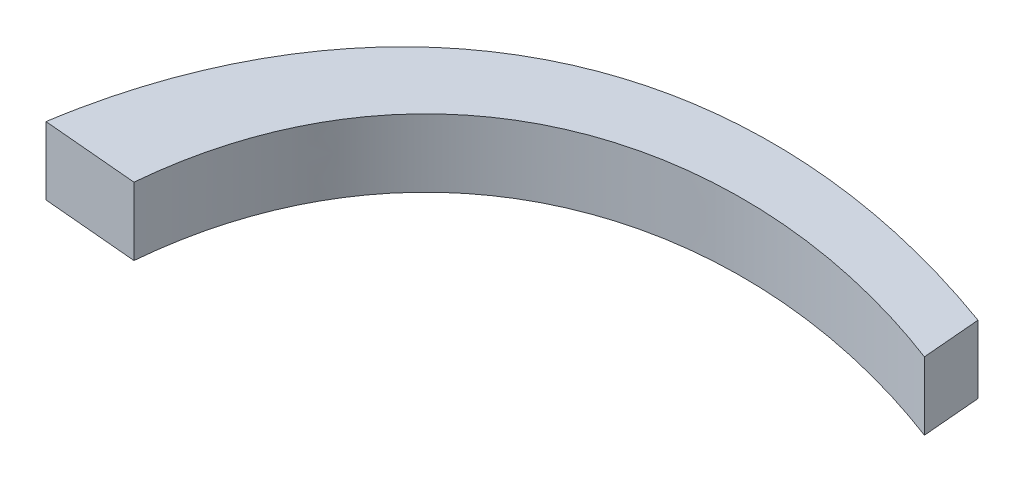
ISO-10303-21;
HEADER;
FILE_DESCRIPTION(('STEP AP214'),'2;1');
FILE_NAME('part.step','',(''),(''),'','','');
FILE_SCHEMA(('AUTOMOTIVE_DESIGN { 1 0 10303 214 1 1 1 1 }'));
ENDSEC;
DATA;
#1=APPLICATION_CONTEXT('core data for automotive mechanical design processes');
#2=APPLICATION_PROTOCOL_DEFINITION('international standard','automotive_design',2000,#1);
#3=PRODUCT_CONTEXT('',#1,'mechanical');
#4=PRODUCT('Part','Part','',(#3));
#5=PRODUCT_RELATED_PRODUCT_CATEGORY('part','',(#4));
#6=PRODUCT_DEFINITION_FORMATION('','',#4);
#7=PRODUCT_DEFINITION_CONTEXT('part definition',#1,'design');
#8=PRODUCT_DEFINITION('design','',#6,#7);
#9=PRODUCT_DEFINITION_SHAPE('','',#8);
#10=(LENGTH_UNIT() NAMED_UNIT(*) SI_UNIT(.MILLI.,.METRE.));
#11=(NAMED_UNIT(*) PLANE_ANGLE_UNIT() SI_UNIT($,.RADIAN.));
#12=(NAMED_UNIT(*) SI_UNIT($,.STERADIAN.) SOLID_ANGLE_UNIT());
#13=UNCERTAINTY_MEASURE_WITH_UNIT(LENGTH_MEASURE(1.E-05),#10,'distance_accuracy_value','');
#14=(GEOMETRIC_REPRESENTATION_CONTEXT(3) GLOBAL_UNCERTAINTY_ASSIGNED_CONTEXT((#13)) GLOBAL_UNIT_ASSIGNED_CONTEXT((#10,
#11,#12)) REPRESENTATION_CONTEXT('',''));
#15=CARTESIAN_POINT('',(0.,0.,0.));
#16=DIRECTION('',(0.,0.,1.));
#17=DIRECTION('',(1.,0.,0.));
#18=AXIS2_PLACEMENT_3D('',#15,#16,#17);
#19=CARTESIAN_POINT('',(22.1742240919369,14.2499982652078,-31.7362850010121));
#20=CARTESIAN_POINT('',(25.529729400877,14.2499982652078,-69.7188077571803));
#21=CARTESIAN_POINT('',(59.0174494625754,14.2499982652078,-80.9025064727403));
#22=CARTESIAN_POINT('',(98.6402805179132,14.2499982652078,-65.8742329275919));
#23=B_SPLINE_CURVE_WITH_KNOTS('',3,(#19,#20,#21,#22),.UNSPECIFIED.,.F.,.F.,(4,4),(0.,1.),.UNSPECIFIED.);
#24=DIRECTION('',(0.,-1.,0.));
#25=VECTOR('',#24,1.);
#26=SURFACE_OF_LINEAR_EXTRUSION('',#23,#25);
#27=CARTESIAN_POINT('',(22.1742240919369,4.74999826520781,-31.7362850010121));
#28=CARTESIAN_POINT('',(25.529729400877,4.74999826520781,-69.7188077571803));
#29=CARTESIAN_POINT('',(59.0174494625754,4.74999826520781,-80.9025064727403));
#30=CARTESIAN_POINT('',(98.6402805179132,4.74999826520781,-65.8742329275919));
#31=B_SPLINE_CURVE_WITH_KNOTS('',3,(#27,#28,#29,#30),.UNSPECIFIED.,.F.,.F.,(4,4),(0.,1.),.UNSPECIFIED.);
#32=CARTESIAN_POINT('',(22.1742240919369,4.74999826520781,-31.7362850010121));
#33=VERTEX_POINT('',#32);
#34=CARTESIAN_POINT('',(98.6402805179132,4.74999826520781,-65.8742329275919));
#35=VERTEX_POINT('',#34);
#36=EDGE_CURVE('E133',#33,#35,#31,.T.);
#37=ORIENTED_EDGE('',*,*,#36,.T.);
#38=DIRECTION('',(0.,-1.,0.));
#39=VECTOR('',#38,1.);
#40=CARTESIAN_POINT('',(98.6402805179132,14.2499982652078,-65.8742329275919));
#41=LINE('',#40,#39);
#42=CARTESIAN_POINT('',(98.6402805179132,14.2499982652078,-65.8742329275919));
#43=VERTEX_POINT('',#42);
#44=EDGE_CURVE('E11',#43,#35,#41,.T.);
#45=ORIENTED_EDGE('',*,*,#44,.F.);
#46=CARTESIAN_POINT('',(22.1742240919369,14.2499982652078,-31.7362850010121));
#47=VERTEX_POINT('',#46);
#48=EDGE_CURVE('E98',#47,#43,#23,.T.);
#49=ORIENTED_EDGE('',*,*,#48,.F.);
#50=DIRECTION('',(0.,-1.,0.));
#51=VECTOR('',#50,1.);
#52=CARTESIAN_POINT('',(22.1742240919369,14.2499982652078,-31.7362850010121));
#53=LINE('',#52,#51);
#54=EDGE_CURVE('E110',#47,#33,#53,.T.);
#55=ORIENTED_EDGE('',*,*,#54,.T.);
#56=EDGE_LOOP('',(#37,#45,#49,#55));
#57=FACE_BOUND('',#56,.T.);
#58=ADVANCED_FACE('F45',(#57),#26,.F.);
#59=CARTESIAN_POINT('',(98.6402805179132,14.2499982652078,-65.8742329275919));
#60=DIRECTION('',(-0.996412567192411,0.,0.0846285763854521));
#61=DIRECTION('',(0.0846285763854522,0.,0.996412567192412));
#62=AXIS2_PLACEMENT_3D('',#59,#60,#61);
#63=PLANE('',#62);
#64=DIRECTION('',(-0.0846285763854522,0.,-0.996412567192412));
#65=VECTOR('',#64,1.);
#66=CARTESIAN_POINT('',(98.6402805179132,4.74999826520781,-65.8742329275919));
#67=LINE('',#66,#65);
#68=CARTESIAN_POINT('',(97.9446060298306,4.74999826520781,-74.0650690754612));
#69=VERTEX_POINT('',#68);
#70=EDGE_CURVE('E103',#35,#69,#67,.T.);
#71=ORIENTED_EDGE('',*,*,#70,.T.);
#72=DIRECTION('',(0.,-1.,0.));
#73=VECTOR('',#72,1.);
#74=CARTESIAN_POINT('',(97.9446060298306,14.2499982652078,-74.0650690754612));
#75=LINE('',#74,#73);
#76=CARTESIAN_POINT('',(97.9446060298306,14.2499982652078,-74.0650690754612));
#77=VERTEX_POINT('',#76);
#78=EDGE_CURVE('E55',#77,#69,#75,.T.);
#79=ORIENTED_EDGE('',*,*,#78,.F.);
#80=DIRECTION('',(-0.0846285763854522,0.,-0.996412567192412));
#81=VECTOR('',#80,1.);
#82=CARTESIAN_POINT('',(98.6402805179132,14.2499982652078,-65.8742329275919));
#83=LINE('',#82,#81);
#84=EDGE_CURVE('E93',#43,#77,#83,.T.);
#85=ORIENTED_EDGE('',*,*,#84,.F.);
#86=ORIENTED_EDGE('',*,*,#44,.T.);
#87=EDGE_LOOP('',(#71,#79,#85,#86));
#88=FACE_BOUND('',#87,.T.);
#89=ADVANCED_FACE('F102',(#88),#63,.F.);
#90=CARTESIAN_POINT('',(97.9446060298306,14.2499982652078,-74.0650690754612));
#91=CARTESIAN_POINT('',(44.2777099209638,14.2499982652078,-93.4813218168931));
#92=CARTESIAN_POINT('',(14.5821212881961,14.2499982652078,-70.8488774554696));
#93=CARTESIAN_POINT('',(8.67652841366942,14.2499982652078,-32.9287173678045));
#94=B_SPLINE_CURVE_WITH_KNOTS('',3,(#90,#91,#92,#93),.UNSPECIFIED.,.F.,.F.,(4,4),(0.,1.),.UNSPECIFIED.);
#95=DIRECTION('',(0.,-1.,0.));
#96=VECTOR('',#95,1.);
#97=SURFACE_OF_LINEAR_EXTRUSION('',#94,#96);
#98=CARTESIAN_POINT('',(97.9446060298306,4.74999826520781,-74.0650690754612));
#99=CARTESIAN_POINT('',(44.2777099209638,4.74999826520781,-93.4813218168931));
#100=CARTESIAN_POINT('',(14.5821212881961,4.74999826520781,-70.8488774554696));
#101=CARTESIAN_POINT('',(8.67652841366942,4.74999826520781,-32.9287173678045));
#102=B_SPLINE_CURVE_WITH_KNOTS('',3,(#98,#99,#100,#101),.UNSPECIFIED.,.F.,.F.,(4,4),(0.,1.),.UNSPECIFIED.);
#103=CARTESIAN_POINT('',(8.67652841366942,4.74999826520781,-32.9287173678045));
#104=VERTEX_POINT('',#103);
#105=EDGE_CURVE('E80',#69,#104,#102,.T.);
#106=ORIENTED_EDGE('',*,*,#105,.T.);
#107=DIRECTION('',(0.,-1.,0.));
#108=VECTOR('',#107,1.);
#109=CARTESIAN_POINT('',(8.67652841366942,14.2499982652078,-32.9287173678045));
#110=LINE('',#109,#108);
#111=CARTESIAN_POINT('',(8.67652841366942,14.2499982652078,-32.9287173678045));
#112=VERTEX_POINT('',#111);
#113=EDGE_CURVE('E105',#112,#104,#110,.T.);
#114=ORIENTED_EDGE('',*,*,#113,.F.);
#115=EDGE_CURVE('E96',#77,#112,#94,.T.);
#116=ORIENTED_EDGE('',*,*,#115,.F.);
#117=ORIENTED_EDGE('',*,*,#78,.T.);
#118=EDGE_LOOP('',(#106,#114,#116,#117));
#119=FACE_BOUND('',#118,.T.);
#120=ADVANCED_FACE('F106',(#119),#97,.F.);
#121=CARTESIAN_POINT('',(22.1742240919369,14.2499982652078,-31.7362850010121));
#122=DIRECTION('',(0.0880006671670734,0.,-0.996120415701912));
#123=DIRECTION('',(-0.996120415701912,0.,-0.0880006671670734));
#124=AXIS2_PLACEMENT_3D('',#121,#122,#123);
#125=PLANE('',#124);
#126=DIRECTION('',(0.996120415701912,0.,0.0880006671670734));
#127=VECTOR('',#126,1.);
#128=CARTESIAN_POINT('',(22.1742240919369,4.74999826520781,-31.7362850010121));
#129=LINE('',#128,#127);
#130=EDGE_CURVE('E86',#104,#33,#129,.T.);
#131=ORIENTED_EDGE('',*,*,#130,.T.);
#132=ORIENTED_EDGE('',*,*,#54,.F.);
#133=DIRECTION('',(0.996120415701912,0.,0.0880006671670734));
#134=VECTOR('',#133,1.);
#135=CARTESIAN_POINT('',(22.1742240919369,14.2499982652078,-31.7362850010121));
#136=LINE('',#135,#134);
#137=EDGE_CURVE('E63',#112,#47,#136,.T.);
#138=ORIENTED_EDGE('',*,*,#137,.F.);
#139=ORIENTED_EDGE('',*,*,#113,.T.);
#140=EDGE_LOOP('',(#131,#132,#138,#139));
#141=FACE_BOUND('',#140,.T.);
#142=ADVANCED_FACE('F122',(#141),#125,.F.);
#143=CARTESIAN_POINT('',(46.8070051500259,14.2499982652078,-68.6843075772957));
#144=DIRECTION('',(0.,1.,0.));
#145=DIRECTION('',(0.,0.,1.));
#146=AXIS2_PLACEMENT_3D('',#143,#144,#145);
#147=PLANE('',#146);
#148=ORIENTED_EDGE('',*,*,#48,.T.);
#149=ORIENTED_EDGE('',*,*,#84,.T.);
#150=ORIENTED_EDGE('',*,*,#115,.T.);
#151=ORIENTED_EDGE('',*,*,#137,.T.);
#152=EDGE_LOOP('',(#148,#149,#150,#151));
#153=FACE_BOUND('',#152,.T.);
#154=ADVANCED_FACE('F94',(#153),#147,.T.);
#155=CARTESIAN_POINT('',(46.8070051500259,4.74999826520781,-68.6843075772957));
#156=DIRECTION('',(0.,1.,0.));
#157=DIRECTION('',(0.,0.,1.));
#158=AXIS2_PLACEMENT_3D('',#155,#156,#157);
#159=PLANE('',#158);
#160=ORIENTED_EDGE('',*,*,#36,.F.);
#161=ORIENTED_EDGE('',*,*,#130,.F.);
#162=ORIENTED_EDGE('',*,*,#105,.F.);
#163=ORIENTED_EDGE('',*,*,#70,.F.);
#164=EDGE_LOOP('',(#160,#161,#162,#163));
#165=FACE_BOUND('',#164,.T.);
#166=ADVANCED_FACE('F156',(#165),#159,.F.);
#167=CLOSED_SHELL('',(#58,#89,#120,#142,#154,#166));
#168=MANIFOLD_SOLID_BREP('B2',#167);
#169=ADVANCED_BREP_SHAPE_REPRESENTATION('',(#18,#168),#14);
#170=SHAPE_DEFINITION_REPRESENTATION(#9,#169);
ENDSEC;
END-ISO-10303-21;
